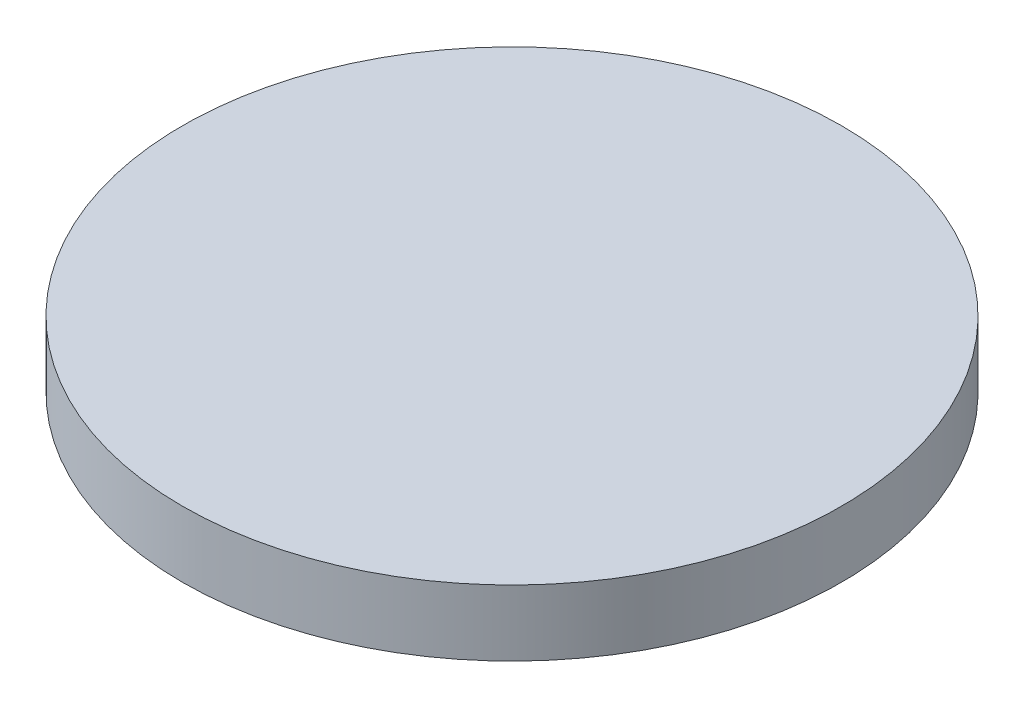
ISO-10303-21;
HEADER;
FILE_DESCRIPTION(('STEP AP214'),'2;1');
FILE_NAME('part.step','',(''),(''),'','','');
FILE_SCHEMA(('AUTOMOTIVE_DESIGN { 1 0 10303 214 1 1 1 1 }'));
ENDSEC;
DATA;
#1=APPLICATION_CONTEXT('core data for automotive mechanical design processes');
#2=APPLICATION_PROTOCOL_DEFINITION('international standard','automotive_design',2000,#1);
#3=PRODUCT_CONTEXT('',#1,'mechanical');
#4=PRODUCT('Part','Part','',(#3));
#5=PRODUCT_RELATED_PRODUCT_CATEGORY('part','',(#4));
#6=PRODUCT_DEFINITION_FORMATION('','',#4);
#7=PRODUCT_DEFINITION_CONTEXT('part definition',#1,'design');
#8=PRODUCT_DEFINITION('design','',#6,#7);
#9=PRODUCT_DEFINITION_SHAPE('','',#8);
#10=(LENGTH_UNIT() NAMED_UNIT(*) SI_UNIT(.MILLI.,.METRE.));
#11=(NAMED_UNIT(*) PLANE_ANGLE_UNIT() SI_UNIT($,.RADIAN.));
#12=(NAMED_UNIT(*) SI_UNIT($,.STERADIAN.) SOLID_ANGLE_UNIT());
#13=UNCERTAINTY_MEASURE_WITH_UNIT(LENGTH_MEASURE(1.E-05),#10,'distance_accuracy_value','');
#14=(GEOMETRIC_REPRESENTATION_CONTEXT(3) GLOBAL_UNCERTAINTY_ASSIGNED_CONTEXT((#13)) GLOBAL_UNIT_ASSIGNED_CONTEXT((#10,
#11,#12)) REPRESENTATION_CONTEXT('',''));
#15=CARTESIAN_POINT('',(0.,0.,0.));
#16=DIRECTION('',(0.,0.,1.));
#17=DIRECTION('',(1.,0.,0.));
#18=AXIS2_PLACEMENT_3D('',#15,#16,#17);
#19=CARTESIAN_POINT('',(0.,8.,0.));
#20=DIRECTION('',(0.,-1.,0.));
#21=DIRECTION('',(0.,0.,-1.));
#22=AXIS2_PLACEMENT_3D('',#19,#20,#21);
#23=CYLINDRICAL_SURFACE('',#22,40.);
#24=CARTESIAN_POINT('',(0.,8.,0.));
#25=DIRECTION('',(0.,1.,0.));
#26=DIRECTION('',(0.,0.,1.));
#27=AXIS2_PLACEMENT_3D('',#24,#25,#26);
#28=CIRCLE('',#27,40.);
#29=CARTESIAN_POINT('',(0.,8.,40.));
#30=VERTEX_POINT('',#29);
#31=EDGE_CURVE('E10',#30,#30,#28,.T.);
#32=ORIENTED_EDGE('',*,*,#31,.F.);
#33=EDGE_LOOP('',(#32));
#34=FACE_BOUND('',#33,.T.);
#35=CARTESIAN_POINT('',(0.,0.,0.));
#36=DIRECTION('',(0.,1.,0.));
#37=DIRECTION('',(0.,0.,1.));
#38=AXIS2_PLACEMENT_3D('',#35,#36,#37);
#39=CIRCLE('',#38,40.);
#40=CARTESIAN_POINT('',(0.,0.,40.));
#41=VERTEX_POINT('',#40);
#42=EDGE_CURVE('E34',#41,#41,#39,.T.);
#43=ORIENTED_EDGE('',*,*,#42,.T.);
#44=EDGE_LOOP('',(#43));
#45=FACE_BOUND('',#44,.T.);
#46=ADVANCED_FACE('F31',(#34,#45),#23,.T.);
#47=CARTESIAN_POINT('',(0.,8.,0.));
#48=DIRECTION('',(0.,1.,0.));
#49=DIRECTION('',(0.,0.,1.));
#50=AXIS2_PLACEMENT_3D('',#47,#48,#49);
#51=PLANE('',#50);
#52=ORIENTED_EDGE('',*,*,#31,.T.);
#53=EDGE_LOOP('',(#52));
#54=FACE_BOUND('',#53,.T.);
#55=ADVANCED_FACE('F46',(#54),#51,.T.);
#56=CARTESIAN_POINT('',(0.,0.,0.));
#57=DIRECTION('',(0.,1.,0.));
#58=DIRECTION('',(0.,0.,1.));
#59=AXIS2_PLACEMENT_3D('',#56,#57,#58);
#60=PLANE('',#59);
#61=ORIENTED_EDGE('',*,*,#42,.F.);
#62=EDGE_LOOP('',(#61));
#63=FACE_BOUND('',#62,.T.);
#64=ADVANCED_FACE('F44',(#63),#60,.F.);
#65=CLOSED_SHELL('',(#46,#55,#64));
#66=MANIFOLD_SOLID_BREP('B2',#65);
#67=ADVANCED_BREP_SHAPE_REPRESENTATION('',(#18,#66),#14);
#68=SHAPE_DEFINITION_REPRESENTATION(#9,#67);
ENDSEC;
END-ISO-10303-21;
